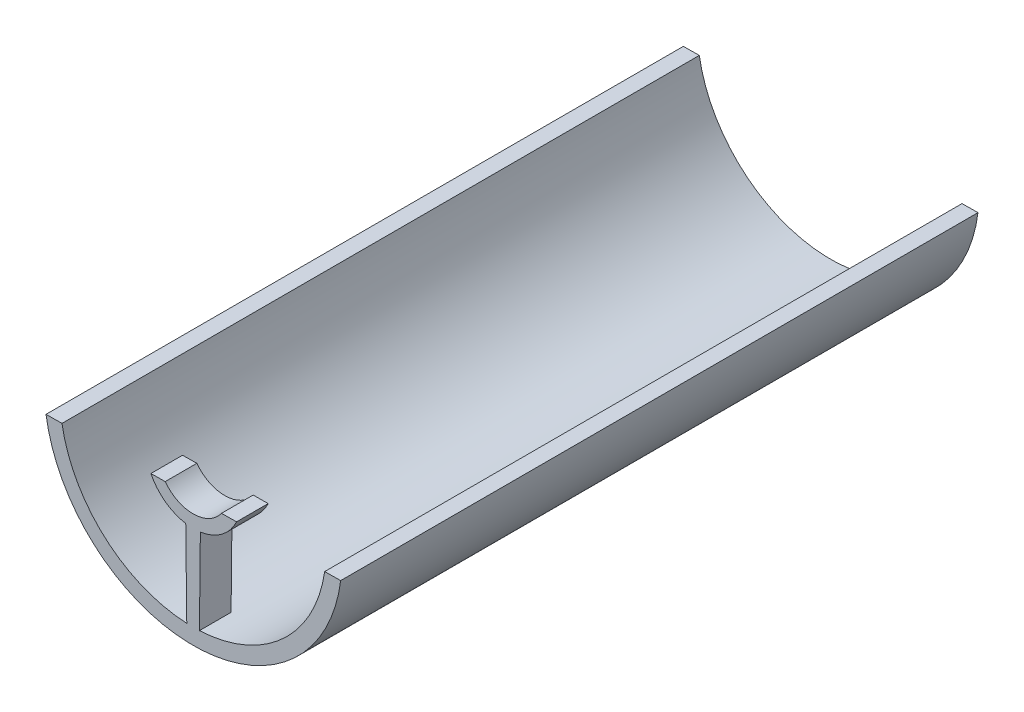
ISO-10303-21;
HEADER;
FILE_DESCRIPTION(('STEP AP214'),'2;1');
FILE_NAME('part.step','',(''),(''),'','','');
FILE_SCHEMA(('AUTOMOTIVE_DESIGN { 1 0 10303 214 1 1 1 1 }'));
ENDSEC;
DATA;
#1=APPLICATION_CONTEXT('core data for automotive mechanical design processes');
#2=APPLICATION_PROTOCOL_DEFINITION('international standard','automotive_design',2000,#1);
#3=PRODUCT_CONTEXT('',#1,'mechanical');
#4=PRODUCT('Part','Part','',(#3));
#5=PRODUCT_RELATED_PRODUCT_CATEGORY('part','',(#4));
#6=PRODUCT_DEFINITION_FORMATION('','',#4);
#7=PRODUCT_DEFINITION_CONTEXT('part definition',#1,'design');
#8=PRODUCT_DEFINITION('design','',#6,#7);
#9=PRODUCT_DEFINITION_SHAPE('','',#8);
#10=(LENGTH_UNIT() NAMED_UNIT(*) SI_UNIT(.MILLI.,.METRE.));
#11=(NAMED_UNIT(*) PLANE_ANGLE_UNIT() SI_UNIT($,.RADIAN.));
#12=(NAMED_UNIT(*) SI_UNIT($,.STERADIAN.) SOLID_ANGLE_UNIT());
#13=UNCERTAINTY_MEASURE_WITH_UNIT(LENGTH_MEASURE(1.E-05),#10,'distance_accuracy_value','');
#14=(GEOMETRIC_REPRESENTATION_CONTEXT(3) GLOBAL_UNCERTAINTY_ASSIGNED_CONTEXT((#13)) GLOBAL_UNIT_ASSIGNED_CONTEXT((#10,
#11,#12)) REPRESENTATION_CONTEXT('',''));
#15=CARTESIAN_POINT('',(0.,0.,0.));
#16=DIRECTION('',(0.,0.,1.));
#17=DIRECTION('',(1.,0.,0.));
#18=AXIS2_PLACEMENT_3D('',#15,#16,#17);
#19=CARTESIAN_POINT('',(0.0468573557127806,-4.11311577984681,0.));
#20=DIRECTION('',(-0.0113914409176292,0.999935115431907,0.));
#21=DIRECTION('',(-0.999935115431907,-0.0113914409176292,0.));
#22=AXIS2_PLACEMENT_3D('',#19,#20,#21);
#23=PLANE('',#22);
#24=DIRECTION('',(0.,0.,-1.));
#25=VECTOR('',#24,1.);
#26=CARTESIAN_POINT('',(26.3960296051398,-3.81294126424523,165.1));
#27=LINE('',#26,#25);
#28=CARTESIAN_POINT('',(26.3960296051398,-3.81294126424523,165.1));
#29=VERTEX_POINT('',#28);
#30=CARTESIAN_POINT('',(26.3960296051398,-3.81294126424523,37.2444601219838));
#31=VERTEX_POINT('',#30);
#32=EDGE_CURVE('E38',#29,#31,#27,.T.);
#33=ORIENTED_EDGE('',*,*,#32,.F.);
#34=DIRECTION('',(-0.999935115431907,-0.0113914409176292,0.));
#35=VECTOR('',#34,1.);
#36=CARTESIAN_POINT('',(0.0468573557127806,-4.11311577984681,165.1));
#37=LINE('',#36,#35);
#38=CARTESIAN_POINT('',(29.6051170954915,-3.77638276161673,165.1));
#39=VERTEX_POINT('',#38);
#40=EDGE_CURVE('E188',#39,#29,#37,.T.);
#41=ORIENTED_EDGE('',*,*,#40,.F.);
#42=DIRECTION('',(0.,0.,-1.));
#43=VECTOR('',#42,1.);
#44=CARTESIAN_POINT('',(29.6051170954915,-3.77638276161673,165.1));
#45=LINE('',#44,#43);
#46=CARTESIAN_POINT('',(29.6051170954915,-3.77638276161673,37.2444601219838));
#47=VERTEX_POINT('',#46);
#48=EDGE_CURVE('E199',#39,#47,#45,.T.);
#49=ORIENTED_EDGE('',*,*,#48,.T.);
#50=DIRECTION('',(-0.999935115431907,-0.0113914409176292,0.));
#51=VECTOR('',#50,1.);
#52=CARTESIAN_POINT('',(-30.1342253049553,-4.45694410895852,37.2444601219838));
#53=LINE('',#52,#51);
#54=EDGE_CURVE('E198',#47,#31,#53,.T.);
#55=ORIENTED_EDGE('',*,*,#54,.T.);
#56=EDGE_LOOP('',(#33,#41,#49,#55));
#57=FACE_BOUND('',#56,.T.);
#58=ADVANCED_FACE('F35',(#57),#23,.T.);
#59=DIRECTION('',(0.,0.,-1.));
#60=VECTOR('',#59,1.);
#61=CARTESIAN_POINT('',(-26.3023148937142,-4.41329029544839,165.1));
#62=LINE('',#61,#60);
#63=CARTESIAN_POINT('',(-26.3023148937142,-4.41329029544839,37.2444601219838));
#64=VERTEX_POINT('',#63);
#65=CARTESIAN_POINT('',(-26.3023148937142,-4.41329029544839,165.1));
#66=VERTEX_POINT('',#65);
#67=EDGE_CURVE('E190',#64,#66,#62,.F.);
#68=ORIENTED_EDGE('',*,*,#67,.F.);
#69=CARTESIAN_POINT('',(-29.511402384066,-4.44984879807689,37.2444601219838));
#70=VERTEX_POINT('',#69);
#71=EDGE_CURVE('E184',#64,#70,#53,.T.);
#72=ORIENTED_EDGE('',*,*,#71,.T.);
#73=DIRECTION('',(0.,0.,-1.));
#74=VECTOR('',#73,1.);
#75=CARTESIAN_POINT('',(-29.511402384066,-4.44984879807689,165.1));
#76=LINE('',#75,#74);
#77=CARTESIAN_POINT('',(-29.511402384066,-4.44984879807689,165.1));
#78=VERTEX_POINT('',#77);
#79=EDGE_CURVE('E195',#70,#78,#76,.F.);
#80=ORIENTED_EDGE('',*,*,#79,.T.);
#81=EDGE_CURVE('E187',#66,#78,#37,.T.);
#82=ORIENTED_EDGE('',*,*,#81,.F.);
#83=EDGE_LOOP('',(#68,#72,#80,#82));
#84=FACE_BOUND('',#83,.T.);
#85=ADVANCED_FACE('F221',(#84),#23,.T.);
#86=CARTESIAN_POINT('',(8.71511229198681,-4.01436545850935,165.1));
#87=VERTEX_POINT('',#86);
#88=CARTESIAN_POINT('',(5.69187040455773,-4.04880677455961,165.1));
#89=VERTEX_POINT('',#88);
#90=EDGE_CURVE('E191',#87,#89,#37,.T.);
#91=ORIENTED_EDGE('',*,*,#90,.F.);
#92=DIRECTION('',(0.,0.,1.));
#93=VECTOR('',#92,1.);
#94=CARTESIAN_POINT('',(8.71511229198681,-4.01436545850935,158.75));
#95=LINE('',#94,#93);
#96=CARTESIAN_POINT('',(8.71511229198681,-4.01436545850935,158.75));
#97=VERTEX_POINT('',#96);
#98=EDGE_CURVE('E178',#97,#87,#95,.T.);
#99=ORIENTED_EDGE('',*,*,#98,.F.);
#100=DIRECTION('',(-0.999935115431907,-0.0113914409176292,0.));
#101=VECTOR('',#100,1.);
#102=CARTESIAN_POINT('',(0.0468573557127806,-4.11311577984681,158.75));
#103=LINE('',#102,#101);
#104=CARTESIAN_POINT('',(5.69187040455773,-4.04880677455961,158.75));
#105=VERTEX_POINT('',#104);
#106=EDGE_CURVE('E43',#97,#105,#103,.T.);
#107=ORIENTED_EDGE('',*,*,#106,.T.);
#108=DIRECTION('',(0.,0.,1.));
#109=VECTOR('',#108,1.);
#110=CARTESIAN_POINT('',(5.69187040455773,-4.04880677455961,158.75));
#111=LINE('',#110,#109);
#112=EDGE_CURVE('E183',#105,#89,#111,.T.);
#113=ORIENTED_EDGE('',*,*,#112,.T.);
#114=EDGE_LOOP('',(#91,#99,#107,#113));
#115=FACE_BOUND('',#114,.T.);
#116=ADVANCED_FACE('F233',(#115),#23,.T.);
#117=CARTESIAN_POINT('',(-5.59815569313217,-4.17742478513401,165.1));
#118=VERTEX_POINT('',#117);
#119=CARTESIAN_POINT('',(-8.46666643931685,-4.21010337615702,165.1));
#120=VERTEX_POINT('',#119);
#121=EDGE_CURVE('E224',#118,#120,#37,.T.);
#122=ORIENTED_EDGE('',*,*,#121,.F.);
#123=DIRECTION('',(0.,0.,1.));
#124=VECTOR('',#123,1.);
#125=CARTESIAN_POINT('',(-5.59815569313217,-4.17742478513401,158.75));
#126=LINE('',#125,#124);
#127=CARTESIAN_POINT('',(-5.59815569313217,-4.17742478513401,158.75));
#128=VERTEX_POINT('',#127);
#129=EDGE_CURVE('E180',#118,#128,#126,.F.);
#130=ORIENTED_EDGE('',*,*,#129,.T.);
#131=CARTESIAN_POINT('',(-8.46666643931685,-4.21010337615702,158.75));
#132=VERTEX_POINT('',#131);
#133=EDGE_CURVE('E11',#128,#132,#103,.T.);
#134=ORIENTED_EDGE('',*,*,#133,.T.);
#135=DIRECTION('',(0.,0.,1.));
#136=VECTOR('',#135,1.);
#137=CARTESIAN_POINT('',(-8.46666643931685,-4.21010337615702,158.75));
#138=LINE('',#137,#136);
#139=EDGE_CURVE('E185',#120,#132,#138,.F.);
#140=ORIENTED_EDGE('',*,*,#139,.F.);
#141=EDGE_LOOP('',(#122,#130,#134,#140));
#142=FACE_BOUND('',#141,.T.);
#143=ADVANCED_FACE('F238',(#142),#23,.T.);
#144=CARTESIAN_POINT('',(0.,0.,165.1));
#145=DIRECTION('',(0.,0.,1.));
#146=DIRECTION('',(1.,0.,0.));
#147=AXIS2_PLACEMENT_3D('',#144,#145,#146);
#148=PLANE('',#147);
#149=CARTESIAN_POINT('',(0.,0.,165.1));
#150=DIRECTION('',(0.,0.,1.));
#151=DIRECTION('',(1.,0.,0.));
#152=AXIS2_PLACEMENT_3D('',#149,#150,#151);
#153=CIRCLE('',#152,29.845);
#154=EDGE_CURVE('E175',#78,#39,#153,.T.);
#155=ORIENTED_EDGE('',*,*,#154,.T.);
#156=ORIENTED_EDGE('',*,*,#40,.T.);
#157=CARTESIAN_POINT('',(0.,0.,165.1));
#158=DIRECTION('',(0.,0.,1.));
#159=DIRECTION('',(1.,0.,0.));
#160=AXIS2_PLACEMENT_3D('',#157,#158,#159);
#161=CIRCLE('',#160,26.67);
#162=CARTESIAN_POINT('',(1.27,-26.6397447435218,165.1));
#163=VERTEX_POINT('',#162);
#164=EDGE_CURVE('E172',#163,#29,#161,.T.);
#165=ORIENTED_EDGE('',*,*,#164,.F.);
#166=DIRECTION('',(0.0106577827158349,0.999943204220911,0.));
#167=VECTOR('',#166,1.);
#168=CARTESIAN_POINT('',(1.55376022840729,-0.0165605794778845,165.1));
#169=LINE('',#168,#167);
#170=CARTESIAN_POINT('',(1.45348067519036,-9.42507081421846,165.1));
#171=VERTEX_POINT('',#170);
#172=EDGE_CURVE('E153',#163,#171,#169,.T.);
#173=ORIENTED_EDGE('',*,*,#172,.T.);
#174=CARTESIAN_POINT('',(0.0773756112626845,0.,165.1));
#175=DIRECTION('',(0.,0.,1.));
#176=DIRECTION('',(1.,0.,0.));
#177=AXIS2_PLACEMENT_3D('',#174,#175,#176);
#178=CIRCLE('',#177,9.525);
#179=EDGE_CURVE('E128',#171,#87,#178,.T.);
#180=ORIENTED_EDGE('',*,*,#179,.T.);
#181=ORIENTED_EDGE('',*,*,#90,.T.);
#182=CARTESIAN_POINT('',(0.,0.,165.1));
#183=DIRECTION('',(0.,0.,1.));
#184=DIRECTION('',(1.,0.,0.));
#185=AXIS2_PLACEMENT_3D('',#182,#183,#184);
#186=CIRCLE('',#185,6.985);
#187=EDGE_CURVE('E141',#118,#89,#186,.T.);
#188=ORIENTED_EDGE('',*,*,#187,.F.);
#189=ORIENTED_EDGE('',*,*,#121,.T.);
#190=CARTESIAN_POINT('',(0.0773756112626845,0.,165.1));
#191=DIRECTION('',(0.,0.,1.));
#192=DIRECTION('',(1.,0.,0.));
#193=AXIS2_PLACEMENT_3D('',#190,#191,#192);
#194=CIRCLE('',#193,9.525);
#195=CARTESIAN_POINT('',(-1.47728855557888,-9.39726791830151,165.1));
#196=VERTEX_POINT('',#195);
#197=EDGE_CURVE('E159',#120,#196,#194,.T.);
#198=ORIENTED_EDGE('',*,*,#197,.T.);
#199=DIRECTION('',(-0.012021102294379,0.999927743939345,0.));
#200=VECTOR('',#199,1.);
#201=CARTESIAN_POINT('',(-1.59003243367896,-0.0191153237346263,165.1));
#202=LINE('',#201,#200);
#203=CARTESIAN_POINT('',(-1.27,-26.6397447435218,165.1));
#204=VERTEX_POINT('',#203);
#205=EDGE_CURVE('E156',#204,#196,#202,.T.);
#206=ORIENTED_EDGE('',*,*,#205,.F.);
#207=EDGE_CURVE('E173',#66,#204,#161,.T.);
#208=ORIENTED_EDGE('',*,*,#207,.F.);
#209=ORIENTED_EDGE('',*,*,#81,.T.);
#210=EDGE_LOOP('',(#155,#156,#165,#173,#180,#181,#188,#189,#198,#206,#208,#209));
#211=FACE_BOUND('',#210,.T.);
#212=ADVANCED_FACE('F230',(#211),#148,.T.);
#213=CARTESIAN_POINT('',(0.,0.,158.75));
#214=DIRECTION('',(0.,0.,1.));
#215=DIRECTION('',(1.,0.,0.));
#216=AXIS2_PLACEMENT_3D('',#213,#214,#215);
#217=CYLINDRICAL_SURFACE('',#216,6.985);
#218=ORIENTED_EDGE('',*,*,#129,.F.);
#219=ORIENTED_EDGE('',*,*,#187,.T.);
#220=ORIENTED_EDGE('',*,*,#112,.F.);
#221=CARTESIAN_POINT('',(0.,0.,158.75));
#222=DIRECTION('',(0.,0.,1.));
#223=DIRECTION('',(1.,0.,0.));
#224=AXIS2_PLACEMENT_3D('',#221,#222,#223);
#225=CIRCLE('',#224,6.985);
#226=EDGE_CURVE('E151',#128,#105,#225,.T.);
#227=ORIENTED_EDGE('',*,*,#226,.F.);
#228=EDGE_LOOP('',(#218,#219,#220,#227));
#229=FACE_BOUND('',#228,.T.);
#230=ADVANCED_FACE('F236',(#229),#217,.F.);
#231=CARTESIAN_POINT('',(0.0773756112626845,0.,158.75));
#232=DIRECTION('',(0.,0.,1.));
#233=DIRECTION('',(1.,0.,0.));
#234=AXIS2_PLACEMENT_3D('',#231,#232,#233);
#235=CYLINDRICAL_SURFACE('',#234,9.525);
#236=ORIENTED_EDGE('',*,*,#197,.F.);
#237=ORIENTED_EDGE('',*,*,#139,.T.);
#238=CARTESIAN_POINT('',(0.0773756112626845,0.,158.75));
#239=DIRECTION('',(0.,0.,1.));
#240=DIRECTION('',(1.,0.,0.));
#241=AXIS2_PLACEMENT_3D('',#238,#239,#240);
#242=CIRCLE('',#241,9.525);
#243=CARTESIAN_POINT('',(-1.47728855557888,-9.39726791830151,158.75));
#244=VERTEX_POINT('',#243);
#245=EDGE_CURVE('E59',#132,#244,#242,.T.);
#246=ORIENTED_EDGE('',*,*,#245,.T.);
#247=DIRECTION('',(0.,0.,1.));
#248=VECTOR('',#247,1.);
#249=CARTESIAN_POINT('',(-1.47728855557888,-9.39726791830151,158.75));
#250=LINE('',#249,#248);
#251=EDGE_CURVE('E162',#244,#196,#250,.T.);
#252=ORIENTED_EDGE('',*,*,#251,.T.);
#253=EDGE_LOOP('',(#236,#237,#246,#252));
#254=FACE_BOUND('',#253,.T.);
#255=ADVANCED_FACE('F240',(#254),#235,.T.);
#256=CARTESIAN_POINT('',(-1.59003243367896,-0.0191153237346263,158.75));
#257=DIRECTION('',(0.999927743939345,0.012021102294379,0.));
#258=DIRECTION('',(-0.012021102294379,0.999927743939345,0.));
#259=AXIS2_PLACEMENT_3D('',#256,#257,#258);
#260=PLANE('',#259);
#261=ORIENTED_EDGE('',*,*,#205,.T.);
#262=ORIENTED_EDGE('',*,*,#251,.F.);
#263=DIRECTION('',(-0.012021102294379,0.999927743939345,0.));
#264=VECTOR('',#263,1.);
#265=CARTESIAN_POINT('',(-1.59003243367896,-0.0191153237346263,158.75));
#266=LINE('',#265,#264);
#267=CARTESIAN_POINT('',(-1.27,-26.6397447435219,158.75));
#268=VERTEX_POINT('',#267);
#269=EDGE_CURVE('E146',#268,#244,#266,.T.);
#270=ORIENTED_EDGE('',*,*,#269,.F.);
#271=DIRECTION('',(0.,0.,1.));
#272=VECTOR('',#271,1.);
#273=CARTESIAN_POINT('',(-1.27,-26.6397447435218,158.75));
#274=LINE('',#273,#272);
#275=EDGE_CURVE('E132',#268,#204,#274,.T.);
#276=ORIENTED_EDGE('',*,*,#275,.T.);
#277=EDGE_LOOP('',(#261,#262,#270,#276));
#278=FACE_BOUND('',#277,.T.);
#279=ADVANCED_FACE('F244',(#278),#260,.F.);
#280=CARTESIAN_POINT('',(0.,0.,165.1));
#281=DIRECTION('',(0.,0.,-1.));
#282=DIRECTION('',(-1.,0.,0.));
#283=AXIS2_PLACEMENT_3D('',#280,#281,#282);
#284=CYLINDRICAL_SURFACE('',#283,26.67);
#285=ORIENTED_EDGE('',*,*,#164,.T.);
#286=ORIENTED_EDGE('',*,*,#32,.T.);
#287=CARTESIAN_POINT('',(0.,0.,37.2444601219838));
#288=DIRECTION('',(0.,0.,1.));
#289=DIRECTION('',(1.,0.,0.));
#290=AXIS2_PLACEMENT_3D('',#287,#288,#289);
#291=CIRCLE('',#290,26.67);
#292=EDGE_CURVE('E177',#64,#31,#291,.T.);
#293=ORIENTED_EDGE('',*,*,#292,.F.);
#294=ORIENTED_EDGE('',*,*,#67,.T.);
#295=ORIENTED_EDGE('',*,*,#207,.T.);
#296=ORIENTED_EDGE('',*,*,#275,.F.);
#297=CARTESIAN_POINT('',(0.,0.,158.75));
#298=DIRECTION('',(0.,0.,1.));
#299=DIRECTION('',(1.,0.,0.));
#300=AXIS2_PLACEMENT_3D('',#297,#298,#299);
#301=CIRCLE('',#300,26.67);
#302=CARTESIAN_POINT('',(1.27,-26.6397447435218,158.75));
#303=VERTEX_POINT('',#302);
#304=EDGE_CURVE('E165',#268,#303,#301,.T.);
#305=ORIENTED_EDGE('',*,*,#304,.T.);
#306=DIRECTION('',(0.,0.,1.));
#307=VECTOR('',#306,1.);
#308=CARTESIAN_POINT('',(1.27,-26.6397447435218,158.75));
#309=LINE('',#308,#307);
#310=EDGE_CURVE('E133',#303,#163,#309,.T.);
#311=ORIENTED_EDGE('',*,*,#310,.T.);
#312=EDGE_LOOP('',(#285,#286,#293,#294,#295,#296,#305,#311));
#313=FACE_BOUND('',#312,.T.);
#314=ADVANCED_FACE('F211',(#313),#284,.F.);
#315=CARTESIAN_POINT('',(1.55376022840729,-0.0165605794778845,158.75));
#316=DIRECTION('',(0.999943204220911,-0.0106577827158349,0.));
#317=DIRECTION('',(0.0106577827158349,0.999943204220911,0.));
#318=AXIS2_PLACEMENT_3D('',#315,#316,#317);
#319=PLANE('',#318);
#320=ORIENTED_EDGE('',*,*,#172,.F.);
#321=ORIENTED_EDGE('',*,*,#310,.F.);
#322=DIRECTION('',(0.0106577827158349,0.999943204220911,0.));
#323=VECTOR('',#322,1.);
#324=CARTESIAN_POINT('',(1.55376022840729,-0.0165605794778845,158.75));
#325=LINE('',#324,#323);
#326=CARTESIAN_POINT('',(1.45348067519036,-9.42507081421846,158.75));
#327=VERTEX_POINT('',#326);
#328=EDGE_CURVE('E137',#303,#327,#325,.T.);
#329=ORIENTED_EDGE('',*,*,#328,.T.);
#330=DIRECTION('',(0.,0.,1.));
#331=VECTOR('',#330,1.);
#332=CARTESIAN_POINT('',(1.45348067519036,-9.42507081421846,158.75));
#333=LINE('',#332,#331);
#334=EDGE_CURVE('E124',#327,#171,#333,.T.);
#335=ORIENTED_EDGE('',*,*,#334,.T.);
#336=EDGE_LOOP('',(#320,#321,#329,#335));
#337=FACE_BOUND('',#336,.T.);
#338=ADVANCED_FACE('F138',(#337),#319,.T.);
#339=CARTESIAN_POINT('',(0.0773756112626845,0.,158.75));
#340=DIRECTION('',(0.,0.,1.));
#341=DIRECTION('',(1.,0.,0.));
#342=AXIS2_PLACEMENT_3D('',#339,#340,#341);
#343=CYLINDRICAL_SURFACE('',#342,9.525);
#344=CARTESIAN_POINT('',(0.0773756112626845,0.,158.75));
#345=DIRECTION('',(0.,0.,1.));
#346=DIRECTION('',(1.,0.,0.));
#347=AXIS2_PLACEMENT_3D('',#344,#345,#346);
#348=CIRCLE('',#347,9.525);
#349=EDGE_CURVE('E51',#327,#97,#348,.T.);
#350=ORIENTED_EDGE('',*,*,#349,.T.);
#351=ORIENTED_EDGE('',*,*,#98,.T.);
#352=ORIENTED_EDGE('',*,*,#179,.F.);
#353=ORIENTED_EDGE('',*,*,#334,.F.);
#354=EDGE_LOOP('',(#350,#351,#352,#353));
#355=FACE_BOUND('',#354,.T.);
#356=ADVANCED_FACE('F126',(#355),#343,.T.);
#357=CARTESIAN_POINT('',(0.,0.,158.75));
#358=DIRECTION('',(0.,0.,1.));
#359=DIRECTION('',(1.,0.,0.));
#360=AXIS2_PLACEMENT_3D('',#357,#358,#359);
#361=PLANE('',#360);
#362=ORIENTED_EDGE('',*,*,#106,.F.);
#363=ORIENTED_EDGE('',*,*,#349,.F.);
#364=ORIENTED_EDGE('',*,*,#328,.F.);
#365=ORIENTED_EDGE('',*,*,#304,.F.);
#366=ORIENTED_EDGE('',*,*,#269,.T.);
#367=ORIENTED_EDGE('',*,*,#245,.F.);
#368=ORIENTED_EDGE('',*,*,#133,.F.);
#369=ORIENTED_EDGE('',*,*,#226,.T.);
#370=EDGE_LOOP('',(#362,#363,#364,#365,#366,#367,#368,#369));
#371=FACE_BOUND('',#370,.T.);
#372=ADVANCED_FACE('F144',(#371),#361,.F.);
#373=CARTESIAN_POINT('',(0.,0.,165.1));
#374=DIRECTION('',(0.,0.,-1.));
#375=DIRECTION('',(-1.,0.,0.));
#376=AXIS2_PLACEMENT_3D('',#373,#374,#375);
#377=CYLINDRICAL_SURFACE('',#376,29.845);
#378=ORIENTED_EDGE('',*,*,#48,.F.);
#379=ORIENTED_EDGE('',*,*,#154,.F.);
#380=ORIENTED_EDGE('',*,*,#79,.F.);
#381=CARTESIAN_POINT('',(0.,0.,37.2444601219838));
#382=DIRECTION('',(0.,0.,1.));
#383=DIRECTION('',(1.,0.,0.));
#384=AXIS2_PLACEMENT_3D('',#381,#382,#383);
#385=CIRCLE('',#384,29.845);
#386=EDGE_CURVE('E170',#70,#47,#385,.T.);
#387=ORIENTED_EDGE('',*,*,#386,.T.);
#388=EDGE_LOOP('',(#378,#379,#380,#387));
#389=FACE_BOUND('',#388,.T.);
#390=ADVANCED_FACE('F247',(#389),#377,.T.);
#391=CARTESIAN_POINT('',(-29.845,-29.845,37.2444601219838));
#392=DIRECTION('',(0.,0.,1.));
#393=DIRECTION('',(1.,0.,0.));
#394=AXIS2_PLACEMENT_3D('',#391,#392,#393);
#395=PLANE('',#394);
#396=ORIENTED_EDGE('',*,*,#54,.F.);
#397=ORIENTED_EDGE('',*,*,#386,.F.);
#398=ORIENTED_EDGE('',*,*,#71,.F.);
#399=ORIENTED_EDGE('',*,*,#292,.T.);
#400=EDGE_LOOP('',(#396,#397,#398,#399));
#401=FACE_BOUND('',#400,.T.);
#402=ADVANCED_FACE('F217',(#401),#395,.F.);
#403=CLOSED_SHELL('',(#58,#85,#116,#143,#212,#230,#255,#279,#314,#338,#356,#372,#390,#402));
#404=MANIFOLD_SOLID_BREP('B2',#403);
#405=ADVANCED_BREP_SHAPE_REPRESENTATION('',(#18,#404),#14);
#406=SHAPE_DEFINITION_REPRESENTATION(#9,#405);
ENDSEC;
END-ISO-10303-21;
